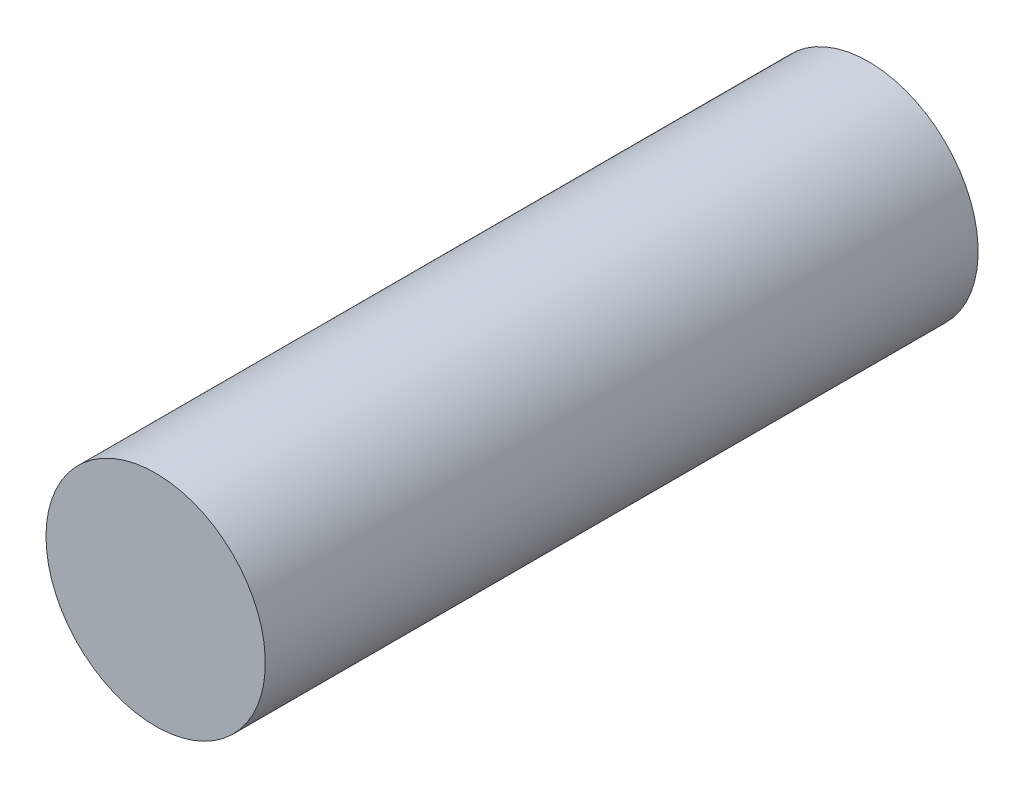
ISO-10303-21;
HEADER;
FILE_DESCRIPTION(('STEP AP214'),'2;1');
FILE_NAME('part.step','',(''),(''),'','','');
FILE_SCHEMA(('AUTOMOTIVE_DESIGN { 1 0 10303 214 1 1 1 1 }'));
ENDSEC;
DATA;
#1=APPLICATION_CONTEXT('core data for automotive mechanical design processes');
#2=APPLICATION_PROTOCOL_DEFINITION('international standard','automotive_design',2000,#1);
#3=PRODUCT_CONTEXT('',#1,'mechanical');
#4=PRODUCT('Part','Part','',(#3));
#5=PRODUCT_RELATED_PRODUCT_CATEGORY('part','',(#4));
#6=PRODUCT_DEFINITION_FORMATION('','',#4);
#7=PRODUCT_DEFINITION_CONTEXT('part definition',#1,'design');
#8=PRODUCT_DEFINITION('design','',#6,#7);
#9=PRODUCT_DEFINITION_SHAPE('','',#8);
#10=(LENGTH_UNIT() NAMED_UNIT(*) SI_UNIT(.MILLI.,.METRE.));
#11=(NAMED_UNIT(*) PLANE_ANGLE_UNIT() SI_UNIT($,.RADIAN.));
#12=(NAMED_UNIT(*) SI_UNIT($,.STERADIAN.) SOLID_ANGLE_UNIT());
#13=UNCERTAINTY_MEASURE_WITH_UNIT(LENGTH_MEASURE(1.E-05),#10,'distance_accuracy_value','');
#14=(GEOMETRIC_REPRESENTATION_CONTEXT(3) GLOBAL_UNCERTAINTY_ASSIGNED_CONTEXT((#13)) GLOBAL_UNIT_ASSIGNED_CONTEXT((#10,
#11,#12)) REPRESENTATION_CONTEXT('',''));
#15=CARTESIAN_POINT('',(0.,0.,0.));
#16=DIRECTION('',(0.,0.,1.));
#17=DIRECTION('',(1.,0.,0.));
#18=AXIS2_PLACEMENT_3D('',#15,#16,#17);
#19=CARTESIAN_POINT('',(0.,0.,52.));
#20=DIRECTION('',(0.,0.,-1.));
#21=DIRECTION('',(-1.,0.,0.));
#22=AXIS2_PLACEMENT_3D('',#19,#20,#21);
#23=CYLINDRICAL_SURFACE('',#22,8.);
#24=CARTESIAN_POINT('',(0.,0.,52.));
#25=DIRECTION('',(0.,0.,1.));
#26=DIRECTION('',(1.,0.,0.));
#27=AXIS2_PLACEMENT_3D('',#24,#25,#26);
#28=CIRCLE('',#27,8.);
#29=CARTESIAN_POINT('',(-8.,0.,52.));
#30=VERTEX_POINT('',#29);
#31=EDGE_CURVE('E10',#30,#30,#28,.T.);
#32=CARTESIAN_POINT('',(0.,0.,0.));
#33=DIRECTION('',(0.,0.,1.));
#34=DIRECTION('',(1.,0.,0.));
#35=AXIS2_PLACEMENT_3D('',#32,#33,#34);
#36=CIRCLE('',#35,8.);
#37=CARTESIAN_POINT('',(-8.,0.,0.));
#38=VERTEX_POINT('',#37);
#39=EDGE_CURVE('E42',#38,#38,#36,.T.);
#40=CARTESIAN_POINT('',(-8.,0.,52.));
#41=CARTESIAN_POINT('',(-8.,0.,51.4583333333333));
#42=CARTESIAN_POINT('',(-8.,0.,50.9166666666667));
#43=CARTESIAN_POINT('',(-8.,0.,49.8333333333333));
#44=CARTESIAN_POINT('',(-8.,0.,49.2916666666667));
#45=CARTESIAN_POINT('',(-8.,0.,48.2083333333333));
#46=CARTESIAN_POINT('',(-8.,0.,47.6666666666667));
#47=CARTESIAN_POINT('',(-8.,0.,46.5833333333333));
#48=CARTESIAN_POINT('',(-8.,0.,46.0416666666667));
#49=CARTESIAN_POINT('',(-8.,0.,44.9583333333333));
#50=CARTESIAN_POINT('',(-8.,0.,44.4166666666667));
#51=CARTESIAN_POINT('',(-8.,0.,43.3333333333333));
#52=CARTESIAN_POINT('',(-8.,0.,42.7916666666667));
#53=CARTESIAN_POINT('',(-8.,0.,41.7083333333333));
#54=CARTESIAN_POINT('',(-8.,0.,41.1666666666667));
#55=CARTESIAN_POINT('',(-8.,0.,40.0833333333333));
#56=CARTESIAN_POINT('',(-8.,0.,39.5416666666667));
#57=CARTESIAN_POINT('',(-8.,0.,38.4583333333333));
#58=CARTESIAN_POINT('',(-8.,0.,37.9166666666667));
#59=CARTESIAN_POINT('',(-8.,0.,36.8333333333333));
#60=CARTESIAN_POINT('',(-8.,0.,36.2916666666667));
#61=CARTESIAN_POINT('',(-8.,0.,35.2083333333333));
#62=CARTESIAN_POINT('',(-8.,0.,34.6666666666667));
#63=CARTESIAN_POINT('',(-8.,0.,33.5833333333333));
#64=CARTESIAN_POINT('',(-8.,0.,33.0416666666667));
#65=CARTESIAN_POINT('',(-8.,0.,31.9583333333333));
#66=CARTESIAN_POINT('',(-8.,0.,31.4166666666667));
#67=CARTESIAN_POINT('',(-8.,0.,30.3333333333333));
#68=CARTESIAN_POINT('',(-8.,0.,29.7916666666667));
#69=CARTESIAN_POINT('',(-8.,0.,28.7083333333333));
#70=CARTESIAN_POINT('',(-8.,0.,28.1666666666667));
#71=CARTESIAN_POINT('',(-8.,0.,27.0833333333333));
#72=CARTESIAN_POINT('',(-8.,0.,26.5416666666667));
#73=CARTESIAN_POINT('',(-8.,0.,25.4583333333333));
#74=CARTESIAN_POINT('',(-8.,0.,24.9166666666667));
#75=CARTESIAN_POINT('',(-8.,0.,23.8333333333333));
#76=CARTESIAN_POINT('',(-8.,0.,23.2916666666667));
#77=CARTESIAN_POINT('',(-8.,0.,22.2083333333333));
#78=CARTESIAN_POINT('',(-8.,0.,21.6666666666667));
#79=CARTESIAN_POINT('',(-8.,0.,20.5833333333333));
#80=CARTESIAN_POINT('',(-8.,0.,20.0416666666667));
#81=CARTESIAN_POINT('',(-8.,0.,18.9583333333333));
#82=CARTESIAN_POINT('',(-8.,0.,18.4166666666667));
#83=CARTESIAN_POINT('',(-8.,0.,17.3333333333333));
#84=CARTESIAN_POINT('',(-8.,0.,16.7916666666667));
#85=CARTESIAN_POINT('',(-8.,0.,15.7083333333333));
#86=CARTESIAN_POINT('',(-8.,0.,15.1666666666667));
#87=CARTESIAN_POINT('',(-8.,0.,14.0833333333333));
#88=CARTESIAN_POINT('',(-8.,0.,13.5416666666667));
#89=CARTESIAN_POINT('',(-8.,0.,12.4583333333333));
#90=CARTESIAN_POINT('',(-8.,0.,11.9166666666667));
#91=CARTESIAN_POINT('',(-8.,0.,10.8333333333333));
#92=CARTESIAN_POINT('',(-8.,0.,10.2916666666667));
#93=CARTESIAN_POINT('',(-8.,0.,9.20833333333333));
#94=CARTESIAN_POINT('',(-8.,0.,8.66666666666667));
#95=CARTESIAN_POINT('',(-8.,0.,7.58333333333333));
#96=CARTESIAN_POINT('',(-8.,0.,7.04166666666667));
#97=CARTESIAN_POINT('',(-8.,0.,5.95833333333333));
#98=CARTESIAN_POINT('',(-8.,0.,5.41666666666667));
#99=CARTESIAN_POINT('',(-8.,0.,4.33333333333333));
#100=CARTESIAN_POINT('',(-8.,0.,3.79166666666667));
#101=CARTESIAN_POINT('',(-8.,0.,2.70833333333334));
#102=CARTESIAN_POINT('',(-8.,0.,2.16666666666667));
#103=CARTESIAN_POINT('',(-8.,0.,1.08333333333333));
#104=CARTESIAN_POINT('',(-8.,0.,0.541666666666667));
#105=CARTESIAN_POINT('',(-8.,0.,0.));
#106=B_SPLINE_CURVE_WITH_KNOTS('',3,(#40,#41,#42,#43,#44,#45,#46,#47,#48,#49,#50,#51,#52,#53,
#54,#55,#56,#57,#58,#59,#60,#61,#62,#63,#64,#65,#66,#67,#68,#69,#70,#71,#72,#73,#74,#75,#76,#77,
#78,#79,#80,#81,#82,#83,#84,#85,#86,#87,#88,#89,#90,#91,#92,#93,#94,#95,#96,#97,#98,#99,#100,
#101,#102,#103,#104,#105),.UNSPECIFIED.,.F.,.F.,(4,2,2,2,2,2,2,2,2,2,2,2,2,2,2,2,2,2,2,2,2,2,2,
2,2,2,2,2,2,2,2,2,4),(0.,1.625,3.25,4.875,6.50000000000001,8.125,9.75,11.375,13.,14.625,16.25,
17.875,19.5,21.125,22.75,24.375,26.,27.625,29.25,30.875,32.5,34.125,35.75,37.375,39.,40.625,
42.25,43.875,45.5,47.125,48.75,50.375,52.),.UNSPECIFIED.);
#107=EDGE_CURVE('BSEAM39',#30,#38,#106,.T.);
#108=ORIENTED_EDGE('',*,*,#31,.F.);
#109=ORIENTED_EDGE('',*,*,#39,.T.);
#110=ORIENTED_EDGE('',*,*,#107,.T.);
#111=ORIENTED_EDGE('',*,*,#107,.F.);
#112=EDGE_LOOP('',(#108,#110,#109,#111));
#113=FACE_BOUND('',#112,.T.);
#114=ADVANCED_FACE('F39',(#113),#23,.T.);
#115=CARTESIAN_POINT('',(0.,0.,52.));
#116=DIRECTION('',(0.,0.,1.));
#117=DIRECTION('',(1.,0.,0.));
#118=AXIS2_PLACEMENT_3D('',#115,#116,#117);
#119=PLANE('',#118);
#120=ORIENTED_EDGE('',*,*,#31,.T.);
#121=EDGE_LOOP('',(#120));
#122=FACE_BOUND('',#121,.T.);
#123=ADVANCED_FACE('F54',(#122),#119,.T.);
#124=CARTESIAN_POINT('',(0.,0.,0.));
#125=DIRECTION('',(0.,0.,1.));
#126=DIRECTION('',(1.,0.,0.));
#127=AXIS2_PLACEMENT_3D('',#124,#125,#126);
#128=PLANE('',#127);
#129=ORIENTED_EDGE('',*,*,#39,.F.);
#130=EDGE_LOOP('',(#129));
#131=FACE_BOUND('',#130,.T.);
#132=ADVANCED_FACE('F52',(#131),#128,.F.);
#133=CLOSED_SHELL('',(#114,#123,#132));
#134=MANIFOLD_SOLID_BREP('B2',#133);
#135=ADVANCED_BREP_SHAPE_REPRESENTATION('',(#18,#134),#14);
#136=SHAPE_DEFINITION_REPRESENTATION(#9,#135);
ENDSEC;
END-ISO-10303-21;
